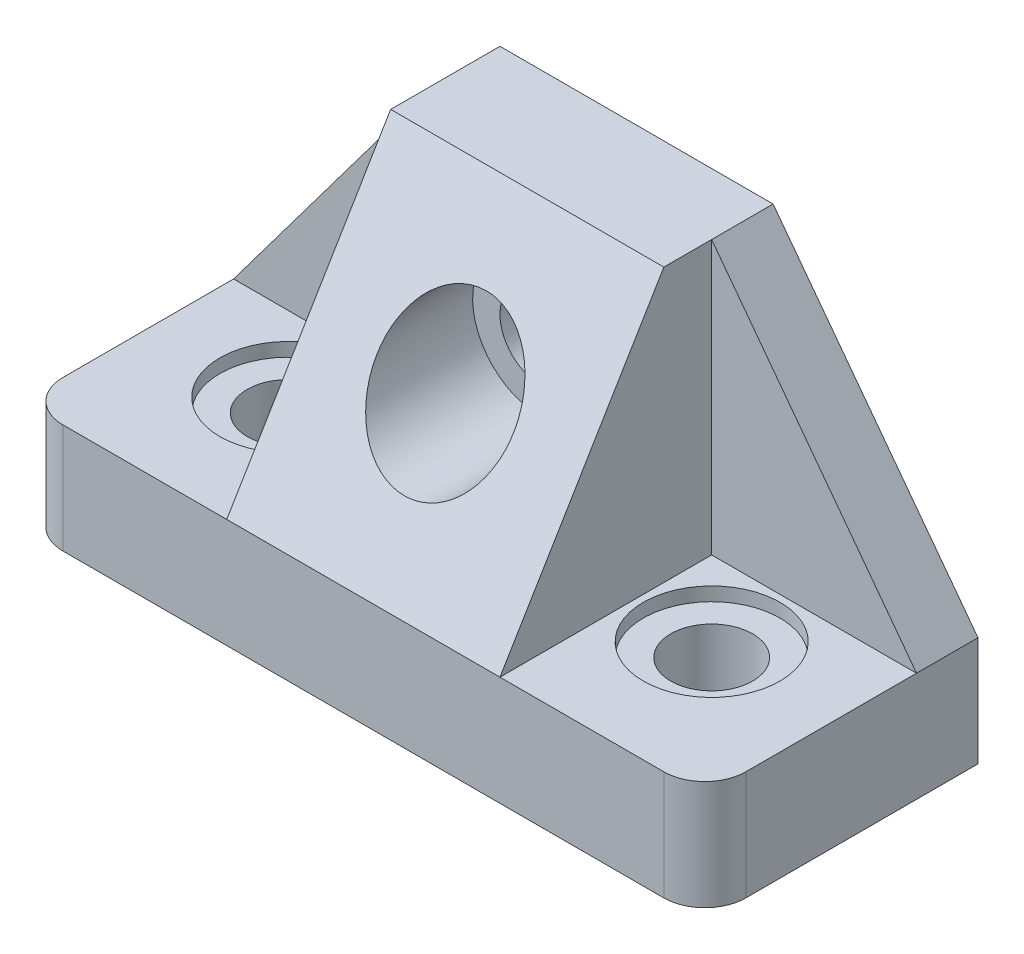
ISO-10303-21;
HEADER;
FILE_DESCRIPTION(('STEP AP214'),'2;1');
FILE_NAME('part.step','',(''),(''),'','','');
FILE_SCHEMA(('AUTOMOTIVE_DESIGN { 1 0 10303 214 1 1 1 1 }'));
ENDSEC;
DATA;
#1=APPLICATION_CONTEXT('core data for automotive mechanical design processes');
#2=APPLICATION_PROTOCOL_DEFINITION('international standard','automotive_design',2000,#1);
#3=PRODUCT_CONTEXT('',#1,'mechanical');
#4=PRODUCT('Part','Part','',(#3));
#5=PRODUCT_RELATED_PRODUCT_CATEGORY('part','',(#4));
#6=PRODUCT_DEFINITION_FORMATION('','',#4);
#7=PRODUCT_DEFINITION_CONTEXT('part definition',#1,'design');
#8=PRODUCT_DEFINITION('design','',#6,#7);
#9=PRODUCT_DEFINITION_SHAPE('','',#8);
#10=(LENGTH_UNIT() NAMED_UNIT(*) SI_UNIT(.MILLI.,.METRE.));
#11=(NAMED_UNIT(*) PLANE_ANGLE_UNIT() SI_UNIT($,.RADIAN.));
#12=(NAMED_UNIT(*) SI_UNIT($,.STERADIAN.) SOLID_ANGLE_UNIT());
#13=UNCERTAINTY_MEASURE_WITH_UNIT(LENGTH_MEASURE(1.E-05),#10,'distance_accuracy_value','');
#14=(GEOMETRIC_REPRESENTATION_CONTEXT(3) GLOBAL_UNCERTAINTY_ASSIGNED_CONTEXT((#13)) GLOBAL_UNIT_ASSIGNED_CONTEXT((#10,
#11,#12)) REPRESENTATION_CONTEXT('',''));
#15=CARTESIAN_POINT('',(0.,0.,0.));
#16=DIRECTION('',(0.,0.,1.));
#17=DIRECTION('',(1.,0.,0.));
#18=AXIS2_PLACEMENT_3D('',#15,#16,#17);
#19=CARTESIAN_POINT('',(22.,8.,7.));
#20=DIRECTION('',(0.,-1.,0.));
#21=DIRECTION('',(0.,0.,-1.));
#22=AXIS2_PLACEMENT_3D('',#19,#20,#21);
#23=CYLINDRICAL_SURFACE('',#22,3.);
#24=DIRECTION('',(0.,-1.,0.));
#25=VECTOR('',#24,1.);
#26=CARTESIAN_POINT('',(25.,8.,7.));
#27=LINE('',#26,#25);
#28=CARTESIAN_POINT('',(25.,8.,7.));
#29=VERTEX_POINT('',#28);
#30=CARTESIAN_POINT('',(25.,0.,7.));
#31=VERTEX_POINT('',#30);
#32=EDGE_CURVE('E195',#29,#31,#27,.T.);
#33=ORIENTED_EDGE('',*,*,#32,.F.);
#34=CARTESIAN_POINT('',(22.,8.,7.));
#35=DIRECTION('',(0.,1.,0.));
#36=DIRECTION('',(0.,0.,1.));
#37=AXIS2_PLACEMENT_3D('',#34,#35,#36);
#38=CIRCLE('',#37,3.);
#39=CARTESIAN_POINT('',(22.,8.,10.));
#40=VERTEX_POINT('',#39);
#41=EDGE_CURVE('E39',#40,#29,#38,.T.);
#42=ORIENTED_EDGE('',*,*,#41,.F.);
#43=DIRECTION('',(0.,-1.,0.));
#44=VECTOR('',#43,1.);
#45=CARTESIAN_POINT('',(22.,8.,10.));
#46=LINE('',#45,#44);
#47=CARTESIAN_POINT('',(22.,0.,10.));
#48=VERTEX_POINT('',#47);
#49=EDGE_CURVE('E198',#48,#40,#46,.F.);
#50=ORIENTED_EDGE('',*,*,#49,.F.);
#51=CARTESIAN_POINT('',(22.,0.,7.));
#52=DIRECTION('',(0.,1.,0.));
#53=DIRECTION('',(0.,0.,1.));
#54=AXIS2_PLACEMENT_3D('',#51,#52,#53);
#55=CIRCLE('',#54,3.);
#56=EDGE_CURVE('E11',#31,#48,#55,.F.);
#57=ORIENTED_EDGE('',*,*,#56,.F.);
#58=EDGE_LOOP('',(#33,#42,#50,#57));
#59=FACE_BOUND('',#58,.T.);
#60=ADVANCED_FACE('F32',(#59),#23,.T.);
#61=CARTESIAN_POINT('',(-22.,8.,7.));
#62=DIRECTION('',(0.,1.,0.));
#63=DIRECTION('',(0.,0.,1.));
#64=AXIS2_PLACEMENT_3D('',#61,#62,#63);
#65=CYLINDRICAL_SURFACE('',#64,3.);
#66=DIRECTION('',(0.,1.,0.));
#67=VECTOR('',#66,1.);
#68=CARTESIAN_POINT('',(-25.,8.,7.));
#69=LINE('',#68,#67);
#70=CARTESIAN_POINT('',(-25.,0.,7.));
#71=VERTEX_POINT('',#70);
#72=CARTESIAN_POINT('',(-25.,8.,7.));
#73=VERTEX_POINT('',#72);
#74=EDGE_CURVE('E184',#71,#73,#69,.T.);
#75=ORIENTED_EDGE('',*,*,#74,.F.);
#76=CARTESIAN_POINT('',(-22.,0.,7.));
#77=DIRECTION('',(0.,1.,0.));
#78=DIRECTION('',(0.,0.,1.));
#79=AXIS2_PLACEMENT_3D('',#76,#77,#78);
#80=CIRCLE('',#79,3.);
#81=CARTESIAN_POINT('',(-22.,0.,10.));
#82=VERTEX_POINT('',#81);
#83=EDGE_CURVE('E191',#82,#71,#80,.F.);
#84=ORIENTED_EDGE('',*,*,#83,.F.);
#85=DIRECTION('',(0.,1.,0.));
#86=VECTOR('',#85,1.);
#87=CARTESIAN_POINT('',(-22.,8.,10.));
#88=LINE('',#87,#86);
#89=CARTESIAN_POINT('',(-22.,8.,10.));
#90=VERTEX_POINT('',#89);
#91=EDGE_CURVE('E187',#90,#82,#88,.F.);
#92=ORIENTED_EDGE('',*,*,#91,.F.);
#93=CARTESIAN_POINT('',(-22.,8.,7.));
#94=DIRECTION('',(0.,1.,0.));
#95=DIRECTION('',(0.,0.,1.));
#96=AXIS2_PLACEMENT_3D('',#93,#94,#95);
#97=CIRCLE('',#96,3.);
#98=EDGE_CURVE('E193',#73,#90,#97,.T.);
#99=ORIENTED_EDGE('',*,*,#98,.F.);
#100=EDGE_LOOP('',(#75,#84,#92,#99));
#101=FACE_BOUND('',#100,.T.);
#102=ADVANCED_FACE('F333',(#101),#65,.T.);
#103=CARTESIAN_POINT('',(-25.,8.,-10.));
#104=DIRECTION('',(0.,0.,1.));
#105=DIRECTION('',(1.,0.,0.));
#106=AXIS2_PLACEMENT_3D('',#103,#104,#105);
#107=PLANE('',#106);
#108=CARTESIAN_POINT('',(0.,18.,-10.));
#109=DIRECTION('',(0.,0.,1.));
#110=DIRECTION('',(1.,0.,0.));
#111=AXIS2_PLACEMENT_3D('',#108,#109,#110);
#112=CIRCLE('',#111,3.);
#113=CARTESIAN_POINT('',(3.,18.,-10.));
#114=VERTEX_POINT('',#113);
#115=EDGE_CURVE('E309',#114,#114,#112,.T.);
#116=ORIENTED_EDGE('',*,*,#115,.T.);
#117=EDGE_LOOP('',(#116));
#118=FACE_BOUND('',#117,.T.);
#119=DIRECTION('',(0.,-1.,0.));
#120=VECTOR('',#119,1.);
#121=CARTESIAN_POINT('',(2.9,10.,-10.));
#122=LINE('',#121,#120);
#123=CARTESIAN_POINT('',(2.9,10.,-10.));
#124=VERTEX_POINT('',#123);
#125=CARTESIAN_POINT('',(2.9,0.,-10.));
#126=VERTEX_POINT('',#125);
#127=EDGE_CURVE('E158',#124,#126,#122,.T.);
#128=ORIENTED_EDGE('',*,*,#127,.F.);
#129=DIRECTION('',(-1.,0.,0.));
#130=VECTOR('',#129,1.);
#131=CARTESIAN_POINT('',(-2.9,10.,-10.));
#132=LINE('',#131,#130);
#133=CARTESIAN_POINT('',(-2.9,10.,-10.));
#134=VERTEX_POINT('',#133);
#135=EDGE_CURVE('E143',#124,#134,#132,.T.);
#136=ORIENTED_EDGE('',*,*,#135,.T.);
#137=DIRECTION('',(0.,-1.,0.));
#138=VECTOR('',#137,1.);
#139=CARTESIAN_POINT('',(-2.9,10.,-10.));
#140=LINE('',#139,#138);
#141=CARTESIAN_POINT('',(-2.9,0.,-10.));
#142=VERTEX_POINT('',#141);
#143=EDGE_CURVE('E168',#134,#142,#140,.T.);
#144=ORIENTED_EDGE('',*,*,#143,.T.);
#145=DIRECTION('',(-1.,0.,0.));
#146=VECTOR('',#145,1.);
#147=CARTESIAN_POINT('',(-25.,0.,-10.));
#148=LINE('',#147,#146);
#149=CARTESIAN_POINT('',(-25.,0.,-10.));
#150=VERTEX_POINT('',#149);
#151=EDGE_CURVE('E231',#142,#150,#148,.T.);
#152=ORIENTED_EDGE('',*,*,#151,.T.);
#153=DIRECTION('',(0.,-1.,0.));
#154=VECTOR('',#153,1.);
#155=CARTESIAN_POINT('',(-25.,8.,-10.));
#156=LINE('',#155,#154);
#157=CARTESIAN_POINT('',(-25.,8.,-10.));
#158=VERTEX_POINT('',#157);
#159=EDGE_CURVE('E228',#158,#150,#156,.T.);
#160=ORIENTED_EDGE('',*,*,#159,.F.);
#161=DIRECTION('',(-0.6,-0.8,0.));
#162=VECTOR('',#161,1.);
#163=CARTESIAN_POINT('',(-10.,28.,-10.));
#164=LINE('',#163,#162);
#165=CARTESIAN_POINT('',(-10.,28.,-10.));
#166=VERTEX_POINT('',#165);
#167=EDGE_CURVE('E298',#166,#158,#164,.T.);
#168=ORIENTED_EDGE('',*,*,#167,.F.);
#169=DIRECTION('',(-1.,0.,0.));
#170=VECTOR('',#169,1.);
#171=CARTESIAN_POINT('',(-10.,28.,-10.));
#172=LINE('',#171,#170);
#173=CARTESIAN_POINT('',(10.,28.,-10.));
#174=VERTEX_POINT('',#173);
#175=EDGE_CURVE('E269',#174,#166,#172,.T.);
#176=ORIENTED_EDGE('',*,*,#175,.F.);
#177=DIRECTION('',(0.6,-0.8,0.));
#178=VECTOR('',#177,1.);
#179=CARTESIAN_POINT('',(10.,28.,-10.));
#180=LINE('',#179,#178);
#181=CARTESIAN_POINT('',(25.,8.,-10.));
#182=VERTEX_POINT('',#181);
#183=EDGE_CURVE('E288',#174,#182,#180,.T.);
#184=ORIENTED_EDGE('',*,*,#183,.T.);
#185=DIRECTION('',(0.,-1.,0.));
#186=VECTOR('',#185,1.);
#187=CARTESIAN_POINT('',(25.,8.,-10.));
#188=LINE('',#187,#186);
#189=CARTESIAN_POINT('',(25.,0.,-10.));
#190=VERTEX_POINT('',#189);
#191=EDGE_CURVE('E188',#182,#190,#188,.T.);
#192=ORIENTED_EDGE('',*,*,#191,.T.);
#193=EDGE_CURVE('E167',#190,#126,#148,.T.);
#194=ORIENTED_EDGE('',*,*,#193,.T.);
#195=EDGE_LOOP('',(#128,#136,#144,#152,#160,#168,#176,#184,#192,#194));
#196=FACE_BOUND('',#195,.T.);
#197=ADVANCED_FACE('F164',(#118,#196),#107,.F.);
#198=CARTESIAN_POINT('',(0.,8.,0.));
#199=DIRECTION('',(0.,1.,0.));
#200=DIRECTION('',(0.,0.,1.));
#201=AXIS2_PLACEMENT_3D('',#198,#199,#200);
#202=PLANE('',#201);
#203=CARTESIAN_POINT('',(15.5,8.,0.));
#204=DIRECTION('',(0.,1.,0.));
#205=DIRECTION('',(0.,0.,1.));
#206=AXIS2_PLACEMENT_3D('',#203,#204,#205);
#207=CIRCLE('',#206,5.);
#208=CARTESIAN_POINT('',(15.5,8.,5.));
#209=VERTEX_POINT('',#208);
#210=EDGE_CURVE('E356',#209,#209,#207,.T.);
#211=ORIENTED_EDGE('',*,*,#210,.F.);
#212=EDGE_LOOP('',(#211));
#213=FACE_BOUND('',#212,.T.);
#214=DIRECTION('',(1.,0.,0.));
#215=VECTOR('',#214,1.);
#216=CARTESIAN_POINT('',(-25.,8.,10.));
#217=LINE('',#216,#215);
#218=CARTESIAN_POINT('',(10.,8.,10.));
#219=VERTEX_POINT('',#218);
#220=EDGE_CURVE('E207',#219,#40,#217,.T.);
#221=ORIENTED_EDGE('',*,*,#220,.T.);
#222=ORIENTED_EDGE('',*,*,#41,.T.);
#223=DIRECTION('',(0.,0.,-1.));
#224=VECTOR('',#223,1.);
#225=CARTESIAN_POINT('',(25.,8.,-10.));
#226=LINE('',#225,#224);
#227=CARTESIAN_POINT('',(25.,8.,-5.5));
#228=VERTEX_POINT('',#227);
#229=EDGE_CURVE('E204',#29,#228,#226,.T.);
#230=ORIENTED_EDGE('',*,*,#229,.T.);
#231=DIRECTION('',(-1.,0.,0.));
#232=VECTOR('',#231,1.);
#233=CARTESIAN_POINT('',(0.,8.,-5.5));
#234=LINE('',#233,#232);
#235=CARTESIAN_POINT('',(10.,8.,-5.5));
#236=VERTEX_POINT('',#235);
#237=EDGE_CURVE('E287',#228,#236,#234,.T.);
#238=ORIENTED_EDGE('',*,*,#237,.T.);
#239=DIRECTION('',(0.,0.,-1.));
#240=VECTOR('',#239,1.);
#241=CARTESIAN_POINT('',(10.,8.,-10.));
#242=LINE('',#241,#240);
#243=EDGE_CURVE('E245',#219,#236,#242,.T.);
#244=ORIENTED_EDGE('',*,*,#243,.F.);
#245=EDGE_LOOP('',(#221,#222,#230,#238,#244));
#246=FACE_BOUND('',#245,.T.);
#247=ADVANCED_FACE('F201',(#213,#246),#202,.T.);
#248=CARTESIAN_POINT('',(10.,28.,-10.));
#249=DIRECTION('',(-1.,0.,0.));
#250=DIRECTION('',(0.,0.,1.));
#251=AXIS2_PLACEMENT_3D('',#248,#249,#250);
#252=PLANE('',#251);
#253=DIRECTION('',(0.,-1.,0.));
#254=VECTOR('',#253,1.);
#255=CARTESIAN_POINT('',(10.,28.,-5.5));
#256=LINE('',#255,#254);
#257=CARTESIAN_POINT('',(10.,28.,-5.5));
#258=VERTEX_POINT('',#257);
#259=EDGE_CURVE('E284',#258,#236,#256,.T.);
#260=ORIENTED_EDGE('',*,*,#259,.F.);
#261=DIRECTION('',(0.,0.,-1.));
#262=VECTOR('',#261,1.);
#263=CARTESIAN_POINT('',(10.,28.,-10.));
#264=LINE('',#263,#262);
#265=CARTESIAN_POINT('',(10.,28.,-2.));
#266=VERTEX_POINT('',#265);
#267=EDGE_CURVE('E266',#266,#258,#264,.T.);
#268=ORIENTED_EDGE('',*,*,#267,.F.);
#269=DIRECTION('',(0.,-0.857492925712544,0.514495755427526));
#270=VECTOR('',#269,1.);
#271=CARTESIAN_POINT('',(10.,28.,-2.));
#272=LINE('',#271,#270);
#273=EDGE_CURVE('E257',#266,#219,#272,.T.);
#274=ORIENTED_EDGE('',*,*,#273,.T.);
#275=ORIENTED_EDGE('',*,*,#243,.T.);
#276=EDGE_LOOP('',(#260,#268,#274,#275));
#277=FACE_BOUND('',#276,.T.);
#278=ADVANCED_FACE('F283',(#277),#252,.F.);
#279=CARTESIAN_POINT('',(-15.5,8.,0.));
#280=DIRECTION('',(0.,1.,0.));
#281=DIRECTION('',(0.,0.,1.));
#282=AXIS2_PLACEMENT_3D('',#279,#280,#281);
#283=CIRCLE('',#282,5.);
#284=CARTESIAN_POINT('',(-15.5,8.,5.));
#285=VERTEX_POINT('',#284);
#286=EDGE_CURVE('E368',#285,#285,#283,.T.);
#287=ORIENTED_EDGE('',*,*,#286,.F.);
#288=EDGE_LOOP('',(#287));
#289=FACE_BOUND('',#288,.T.);
#290=DIRECTION('',(0.,0.,1.));
#291=VECTOR('',#290,1.);
#292=CARTESIAN_POINT('',(-25.,8.,-10.));
#293=LINE('',#292,#291);
#294=CARTESIAN_POINT('',(-25.,8.,-5.5));
#295=VERTEX_POINT('',#294);
#296=EDGE_CURVE('E213',#295,#73,#293,.T.);
#297=ORIENTED_EDGE('',*,*,#296,.T.);
#298=ORIENTED_EDGE('',*,*,#98,.T.);
#299=CARTESIAN_POINT('',(-10.,8.,10.));
#300=VERTEX_POINT('',#299);
#301=EDGE_CURVE('E226',#90,#300,#217,.T.);
#302=ORIENTED_EDGE('',*,*,#301,.T.);
#303=DIRECTION('',(0.,0.,1.));
#304=VECTOR('',#303,1.);
#305=CARTESIAN_POINT('',(-10.,8.,-10.));
#306=LINE('',#305,#304);
#307=CARTESIAN_POINT('',(-10.,8.,-5.5));
#308=VERTEX_POINT('',#307);
#309=EDGE_CURVE('E240',#308,#300,#306,.T.);
#310=ORIENTED_EDGE('',*,*,#309,.F.);
#311=DIRECTION('',(-1.,0.,0.));
#312=VECTOR('',#311,1.);
#313=CARTESIAN_POINT('',(0.,8.,-5.5));
#314=LINE('',#313,#312);
#315=EDGE_CURVE('E305',#308,#295,#314,.T.);
#316=ORIENTED_EDGE('',*,*,#315,.T.);
#317=EDGE_LOOP('',(#297,#298,#302,#310,#316));
#318=FACE_BOUND('',#317,.T.);
#319=ADVANCED_FACE('F379',(#289,#318),#202,.T.);
#320=CARTESIAN_POINT('',(-10.,28.,-10.));
#321=DIRECTION('',(1.,0.,0.));
#322=DIRECTION('',(0.,0.,-1.));
#323=AXIS2_PLACEMENT_3D('',#320,#321,#322);
#324=PLANE('',#323);
#325=DIRECTION('',(0.,1.,0.));
#326=VECTOR('',#325,1.);
#327=CARTESIAN_POINT('',(-10.,28.,-5.5));
#328=LINE('',#327,#326);
#329=CARTESIAN_POINT('',(-10.,28.,-5.5));
#330=VERTEX_POINT('',#329);
#331=EDGE_CURVE('E300',#308,#330,#328,.T.);
#332=ORIENTED_EDGE('',*,*,#331,.F.);
#333=ORIENTED_EDGE('',*,*,#309,.T.);
#334=DIRECTION('',(0.,-0.857492925712544,0.514495755427526));
#335=VECTOR('',#334,1.);
#336=CARTESIAN_POINT('',(-10.,28.,-2.));
#337=LINE('',#336,#335);
#338=CARTESIAN_POINT('',(-10.,28.,-2.));
#339=VERTEX_POINT('',#338);
#340=EDGE_CURVE('E262',#339,#300,#337,.T.);
#341=ORIENTED_EDGE('',*,*,#340,.F.);
#342=DIRECTION('',(0.,0.,1.));
#343=VECTOR('',#342,1.);
#344=CARTESIAN_POINT('',(-10.,28.,-10.));
#345=LINE('',#344,#343);
#346=EDGE_CURVE('E272',#330,#339,#345,.T.);
#347=ORIENTED_EDGE('',*,*,#346,.F.);
#348=EDGE_LOOP('',(#332,#333,#341,#347));
#349=FACE_BOUND('',#348,.T.);
#350=ADVANCED_FACE('F382',(#349),#324,.F.);
#351=CARTESIAN_POINT('',(0.,28.,-2.));
#352=DIRECTION('',(0.,0.514495755427526,0.857492925712544));
#353=DIRECTION('',(0.,-0.857492925712544,0.514495755427526));
#354=AXIS2_PLACEMENT_3D('',#351,#352,#353);
#355=PLANE('',#354);
#356=ORIENTED_EDGE('',*,*,#340,.T.);
#357=DIRECTION('',(1.,0.,0.));
#358=VECTOR('',#357,1.);
#359=CARTESIAN_POINT('',(0.,8.,10.));
#360=LINE('',#359,#358);
#361=EDGE_CURVE('E252',#300,#219,#360,.T.);
#362=ORIENTED_EDGE('',*,*,#361,.T.);
#363=ORIENTED_EDGE('',*,*,#273,.F.);
#364=DIRECTION('',(1.,0.,0.));
#365=VECTOR('',#364,1.);
#366=CARTESIAN_POINT('',(-10.,28.,-2.));
#367=LINE('',#366,#365);
#368=EDGE_CURVE('E232',#339,#266,#367,.T.);
#369=ORIENTED_EDGE('',*,*,#368,.F.);
#370=EDGE_LOOP('',(#356,#362,#363,#369));
#371=FACE_BOUND('',#370,.T.);
#372=CARTESIAN_POINT('',(0.,18.,4.));
#373=DIRECTION('',(0.,0.514495755427526,0.857492925712544));
#374=DIRECTION('',(0.,0.857492925712544,-0.514495755427526));
#375=AXIS2_PLACEMENT_3D('',#372,#373,#374);
#376=ELLIPSE('',#375,5.8309518948453,5.);
#377=CARTESIAN_POINT('',(0.,23.,1.));
#378=VERTEX_POINT('',#377);
#379=EDGE_CURVE('E246',#378,#378,#376,.F.);
#380=ORIENTED_EDGE('',*,*,#379,.T.);
#381=EDGE_LOOP('',(#380));
#382=FACE_BOUND('',#381,.T.);
#383=ADVANCED_FACE('F321',(#371,#382),#355,.T.);
#384=CARTESIAN_POINT('',(25.,8.,-10.));
#385=DIRECTION('',(-1.,0.,0.));
#386=DIRECTION('',(0.,0.,1.));
#387=AXIS2_PLACEMENT_3D('',#384,#385,#386);
#388=PLANE('',#387);
#389=ORIENTED_EDGE('',*,*,#229,.F.);
#390=ORIENTED_EDGE('',*,*,#32,.T.);
#391=DIRECTION('',(0.,0.,-1.));
#392=VECTOR('',#391,1.);
#393=CARTESIAN_POINT('',(25.,0.,-10.));
#394=LINE('',#393,#392);
#395=EDGE_CURVE('E229',#31,#190,#394,.T.);
#396=ORIENTED_EDGE('',*,*,#395,.T.);
#397=ORIENTED_EDGE('',*,*,#191,.F.);
#398=DIRECTION('',(0.,0.,-1.));
#399=VECTOR('',#398,1.);
#400=CARTESIAN_POINT('',(25.,8.,0.));
#401=LINE('',#400,#399);
#402=EDGE_CURVE('E212',#228,#182,#401,.T.);
#403=ORIENTED_EDGE('',*,*,#402,.F.);
#404=EDGE_LOOP('',(#389,#390,#396,#397,#403));
#405=FACE_BOUND('',#404,.T.);
#406=ADVANCED_FACE('F210',(#405),#388,.F.);
#407=CARTESIAN_POINT('',(-25.,8.,-10.));
#408=DIRECTION('',(1.,0.,0.));
#409=DIRECTION('',(0.,0.,-1.));
#410=AXIS2_PLACEMENT_3D('',#407,#408,#409);
#411=PLANE('',#410);
#412=DIRECTION('',(0.,0.,1.));
#413=VECTOR('',#412,1.);
#414=CARTESIAN_POINT('',(-25.,0.,-10.));
#415=LINE('',#414,#413);
#416=EDGE_CURVE('E220',#150,#71,#415,.T.);
#417=ORIENTED_EDGE('',*,*,#416,.T.);
#418=ORIENTED_EDGE('',*,*,#74,.T.);
#419=ORIENTED_EDGE('',*,*,#296,.F.);
#420=EDGE_CURVE('E217',#158,#295,#293,.T.);
#421=ORIENTED_EDGE('',*,*,#420,.F.);
#422=ORIENTED_EDGE('',*,*,#159,.T.);
#423=EDGE_LOOP('',(#417,#418,#419,#421,#422));
#424=FACE_BOUND('',#423,.T.);
#425=ADVANCED_FACE('F337',(#424),#411,.F.);
#426=CARTESIAN_POINT('',(-25.,8.,10.));
#427=DIRECTION('',(0.,0.,-1.));
#428=DIRECTION('',(-1.,0.,0.));
#429=AXIS2_PLACEMENT_3D('',#426,#427,#428);
#430=PLANE('',#429);
#431=DIRECTION('',(1.,0.,0.));
#432=VECTOR('',#431,1.);
#433=CARTESIAN_POINT('',(-25.,0.,10.));
#434=LINE('',#433,#432);
#435=EDGE_CURVE('E214',#82,#48,#434,.T.);
#436=ORIENTED_EDGE('',*,*,#435,.T.);
#437=ORIENTED_EDGE('',*,*,#49,.T.);
#438=ORIENTED_EDGE('',*,*,#220,.F.);
#439=ORIENTED_EDGE('',*,*,#361,.F.);
#440=ORIENTED_EDGE('',*,*,#301,.F.);
#441=ORIENTED_EDGE('',*,*,#91,.T.);
#442=EDGE_LOOP('',(#436,#437,#438,#439,#440,#441));
#443=FACE_BOUND('',#442,.T.);
#444=ADVANCED_FACE('F325',(#443),#430,.F.);
#445=CARTESIAN_POINT('',(0.,0.,0.));
#446=DIRECTION('',(0.,1.,0.));
#447=DIRECTION('',(0.,0.,1.));
#448=AXIS2_PLACEMENT_3D('',#445,#446,#447);
#449=PLANE('',#448);
#450=CARTESIAN_POINT('',(15.5,0.,0.));
#451=DIRECTION('',(0.,1.,0.));
#452=DIRECTION('',(0.,0.,1.));
#453=AXIS2_PLACEMENT_3D('',#450,#451,#452);
#454=CIRCLE('',#453,3.);
#455=CARTESIAN_POINT('',(15.5,0.,3.));
#456=VERTEX_POINT('',#455);
#457=EDGE_CURVE('E353',#456,#456,#454,.T.);
#458=ORIENTED_EDGE('',*,*,#457,.T.);
#459=EDGE_LOOP('',(#458));
#460=FACE_BOUND('',#459,.T.);
#461=CARTESIAN_POINT('',(-15.5,0.,0.));
#462=DIRECTION('',(0.,1.,0.));
#463=DIRECTION('',(0.,0.,1.));
#464=AXIS2_PLACEMENT_3D('',#461,#462,#463);
#465=CIRCLE('',#464,3.);
#466=CARTESIAN_POINT('',(-15.5,0.,3.));
#467=VERTEX_POINT('',#466);
#468=EDGE_CURVE('E365',#467,#467,#465,.T.);
#469=ORIENTED_EDGE('',*,*,#468,.T.);
#470=EDGE_LOOP('',(#469));
#471=FACE_BOUND('',#470,.T.);
#472=ORIENTED_EDGE('',*,*,#395,.F.);
#473=ORIENTED_EDGE('',*,*,#56,.T.);
#474=ORIENTED_EDGE('',*,*,#435,.F.);
#475=ORIENTED_EDGE('',*,*,#83,.T.);
#476=ORIENTED_EDGE('',*,*,#416,.F.);
#477=ORIENTED_EDGE('',*,*,#151,.F.);
#478=DIRECTION('',(0.,0.,-1.));
#479=VECTOR('',#478,1.);
#480=CARTESIAN_POINT('',(-2.9,0.,-10.));
#481=LINE('',#480,#479);
#482=CARTESIAN_POINT('',(-2.9,0.,-13.));
#483=VERTEX_POINT('',#482);
#484=EDGE_CURVE('E181',#142,#483,#481,.T.);
#485=ORIENTED_EDGE('',*,*,#484,.T.);
#486=DIRECTION('',(1.,0.,0.));
#487=VECTOR('',#486,1.);
#488=CARTESIAN_POINT('',(-2.9,0.,-13.));
#489=LINE('',#488,#487);
#490=CARTESIAN_POINT('',(2.9,0.,-13.));
#491=VERTEX_POINT('',#490);
#492=EDGE_CURVE('E161',#483,#491,#489,.T.);
#493=ORIENTED_EDGE('',*,*,#492,.T.);
#494=DIRECTION('',(0.,0.,1.));
#495=VECTOR('',#494,1.);
#496=CARTESIAN_POINT('',(2.9,0.,-10.));
#497=LINE('',#496,#495);
#498=EDGE_CURVE('E179',#491,#126,#497,.T.);
#499=ORIENTED_EDGE('',*,*,#498,.T.);
#500=ORIENTED_EDGE('',*,*,#193,.F.);
#501=EDGE_LOOP('',(#472,#473,#474,#475,#476,#477,#485,#493,#499,#500));
#502=FACE_BOUND('',#501,.T.);
#503=ADVANCED_FACE('F327',(#460,#471,#502),#449,.F.);
#504=CARTESIAN_POINT('',(0.,28.,0.));
#505=DIRECTION('',(0.,1.,0.));
#506=DIRECTION('',(0.,0.,1.));
#507=AXIS2_PLACEMENT_3D('',#504,#505,#506);
#508=PLANE('',#507);
#509=EDGE_CURVE('E273',#166,#330,#345,.T.);
#510=ORIENTED_EDGE('',*,*,#509,.T.);
#511=ORIENTED_EDGE('',*,*,#346,.T.);
#512=ORIENTED_EDGE('',*,*,#368,.T.);
#513=ORIENTED_EDGE('',*,*,#267,.T.);
#514=EDGE_CURVE('E244',#258,#174,#264,.T.);
#515=ORIENTED_EDGE('',*,*,#514,.T.);
#516=ORIENTED_EDGE('',*,*,#175,.T.);
#517=EDGE_LOOP('',(#510,#511,#512,#513,#515,#516));
#518=FACE_BOUND('',#517,.T.);
#519=ADVANCED_FACE('F279',(#518),#508,.T.);
#520=CARTESIAN_POINT('',(0.,18.,9.));
#521=DIRECTION('',(0.,0.,-1.));
#522=DIRECTION('',(-1.,0.,0.));
#523=AXIS2_PLACEMENT_3D('',#520,#521,#522);
#524=CYLINDRICAL_SURFACE('',#523,5.);
#525=ORIENTED_EDGE('',*,*,#379,.F.);
#526=EDGE_LOOP('',(#525));
#527=FACE_BOUND('',#526,.T.);
#528=CARTESIAN_POINT('',(0.,18.,-3.));
#529=DIRECTION('',(0.,0.,1.));
#530=DIRECTION('',(1.,0.,0.));
#531=AXIS2_PLACEMENT_3D('',#528,#529,#530);
#532=CIRCLE('',#531,5.);
#533=CARTESIAN_POINT('',(5.,18.,-3.));
#534=VERTEX_POINT('',#533);
#535=EDGE_CURVE('E312',#534,#534,#532,.T.);
#536=ORIENTED_EDGE('',*,*,#535,.F.);
#537=EDGE_LOOP('',(#536));
#538=FACE_BOUND('',#537,.T.);
#539=ADVANCED_FACE('F429',(#527,#538),#524,.F.);
#540=CARTESIAN_POINT('',(0.,18.,-3.));
#541=DIRECTION('',(0.,0.,1.));
#542=DIRECTION('',(1.,0.,0.));
#543=AXIS2_PLACEMENT_3D('',#540,#541,#542);
#544=PLANE('',#543);
#545=CARTESIAN_POINT('',(0.,18.,-3.));
#546=DIRECTION('',(0.,0.,1.));
#547=DIRECTION('',(1.,0.,0.));
#548=AXIS2_PLACEMENT_3D('',#545,#546,#547);
#549=CIRCLE('',#548,3.);
#550=CARTESIAN_POINT('',(3.,18.,-3.));
#551=VERTEX_POINT('',#550);
#552=EDGE_CURVE('E308',#551,#551,#549,.T.);
#553=ORIENTED_EDGE('',*,*,#552,.F.);
#554=EDGE_LOOP('',(#553));
#555=FACE_BOUND('',#554,.T.);
#556=ORIENTED_EDGE('',*,*,#535,.T.);
#557=EDGE_LOOP('',(#556));
#558=FACE_BOUND('',#557,.T.);
#559=ADVANCED_FACE('F399',(#555,#558),#544,.T.);
#560=CARTESIAN_POINT('',(0.,18.,-10.));
#561=DIRECTION('',(0.,0.,1.));
#562=DIRECTION('',(1.,0.,0.));
#563=AXIS2_PLACEMENT_3D('',#560,#561,#562);
#564=CYLINDRICAL_SURFACE('',#563,3.);
#565=ORIENTED_EDGE('',*,*,#115,.F.);
#566=EDGE_LOOP('',(#565));
#567=FACE_BOUND('',#566,.T.);
#568=ORIENTED_EDGE('',*,*,#552,.T.);
#569=EDGE_LOOP('',(#568));
#570=FACE_BOUND('',#569,.T.);
#571=ADVANCED_FACE('F391',(#567,#570),#564,.F.);
#572=CARTESIAN_POINT('',(-10.,28.,-10.));
#573=DIRECTION('',(0.8,-0.6,0.));
#574=DIRECTION('',(-0.6,-0.8,0.));
#575=AXIS2_PLACEMENT_3D('',#572,#573,#574);
#576=PLANE('',#575);
#577=ORIENTED_EDGE('',*,*,#167,.T.);
#578=ORIENTED_EDGE('',*,*,#420,.T.);
#579=DIRECTION('',(-0.6,-0.8,0.));
#580=VECTOR('',#579,1.);
#581=CARTESIAN_POINT('',(-10.,28.,-5.5));
#582=LINE('',#581,#580);
#583=EDGE_CURVE('E297',#330,#295,#582,.T.);
#584=ORIENTED_EDGE('',*,*,#583,.F.);
#585=ORIENTED_EDGE('',*,*,#509,.F.);
#586=EDGE_LOOP('',(#577,#578,#584,#585));
#587=FACE_BOUND('',#586,.T.);
#588=ADVANCED_FACE('F389',(#587),#576,.F.);
#589=CARTESIAN_POINT('',(0.,14.0000125,-5.5));
#590=DIRECTION('',(0.,0.,-1.));
#591=DIRECTION('',(-1.,0.,0.));
#592=AXIS2_PLACEMENT_3D('',#589,#590,#591);
#593=PLANE('',#592);
#594=ORIENTED_EDGE('',*,*,#315,.F.);
#595=ORIENTED_EDGE('',*,*,#331,.T.);
#596=ORIENTED_EDGE('',*,*,#583,.T.);
#597=EDGE_LOOP('',(#594,#595,#596));
#598=FACE_BOUND('',#597,.T.);
#599=ADVANCED_FACE('F387',(#598),#593,.F.);
#600=CARTESIAN_POINT('',(10.,28.,-10.));
#601=DIRECTION('',(0.8,0.6,0.));
#602=DIRECTION('',(0.6,-0.8,0.));
#603=AXIS2_PLACEMENT_3D('',#600,#601,#602);
#604=PLANE('',#603);
#605=DIRECTION('',(0.6,-0.8,0.));
#606=VECTOR('',#605,1.);
#607=CARTESIAN_POINT('',(10.,28.,-5.5));
#608=LINE('',#607,#606);
#609=EDGE_CURVE('E292',#258,#228,#608,.T.);
#610=ORIENTED_EDGE('',*,*,#609,.T.);
#611=ORIENTED_EDGE('',*,*,#402,.T.);
#612=ORIENTED_EDGE('',*,*,#183,.F.);
#613=ORIENTED_EDGE('',*,*,#514,.F.);
#614=EDGE_LOOP('',(#610,#611,#612,#613));
#615=FACE_BOUND('',#614,.T.);
#616=ADVANCED_FACE('F397',(#615),#604,.T.);
#617=CARTESIAN_POINT('',(1.24999999864817E-05,14.0000125,-5.5));
#618=DIRECTION('',(0.,0.,-1.));
#619=DIRECTION('',(-1.,0.,0.));
#620=AXIS2_PLACEMENT_3D('',#617,#618,#619);
#621=PLANE('',#620);
#622=ORIENTED_EDGE('',*,*,#237,.F.);
#623=ORIENTED_EDGE('',*,*,#609,.F.);
#624=ORIENTED_EDGE('',*,*,#259,.T.);
#625=EDGE_LOOP('',(#622,#623,#624));
#626=FACE_BOUND('',#625,.T.);
#627=ADVANCED_FACE('F462',(#626),#621,.F.);
#628=CARTESIAN_POINT('',(-15.5,7.,0.));
#629=DIRECTION('',(0.,1.,0.));
#630=DIRECTION('',(0.,0.,1.));
#631=AXIS2_PLACEMENT_3D('',#628,#629,#630);
#632=CYLINDRICAL_SURFACE('',#631,5.);
#633=CARTESIAN_POINT('',(-15.5,7.,0.));
#634=DIRECTION('',(0.,1.,0.));
#635=DIRECTION('',(0.,0.,1.));
#636=AXIS2_PLACEMENT_3D('',#633,#634,#635);
#637=CIRCLE('',#636,5.);
#638=CARTESIAN_POINT('',(-15.5,7.,5.));
#639=VERTEX_POINT('',#638);
#640=EDGE_CURVE('E371',#639,#639,#637,.T.);
#641=ORIENTED_EDGE('',*,*,#640,.F.);
#642=EDGE_LOOP('',(#641));
#643=FACE_BOUND('',#642,.T.);
#644=ORIENTED_EDGE('',*,*,#286,.T.);
#645=EDGE_LOOP('',(#644));
#646=FACE_BOUND('',#645,.T.);
#647=ADVANCED_FACE('F377',(#643,#646),#632,.F.);
#648=CARTESIAN_POINT('',(-15.5,7.,0.));
#649=DIRECTION('',(0.,1.,0.));
#650=DIRECTION('',(0.,0.,1.));
#651=AXIS2_PLACEMENT_3D('',#648,#649,#650);
#652=PLANE('',#651);
#653=CARTESIAN_POINT('',(-15.5,7.,0.));
#654=DIRECTION('',(0.,1.,0.));
#655=DIRECTION('',(0.,0.,1.));
#656=AXIS2_PLACEMENT_3D('',#653,#654,#655);
#657=CIRCLE('',#656,3.);
#658=CARTESIAN_POINT('',(-15.5,7.,3.));
#659=VERTEX_POINT('',#658);
#660=EDGE_CURVE('E362',#659,#659,#657,.T.);
#661=ORIENTED_EDGE('',*,*,#660,.F.);
#662=EDGE_LOOP('',(#661));
#663=FACE_BOUND('',#662,.T.);
#664=ORIENTED_EDGE('',*,*,#640,.T.);
#665=EDGE_LOOP('',(#664));
#666=FACE_BOUND('',#665,.T.);
#667=ADVANCED_FACE('F481',(#663,#666),#652,.T.);
#668=CARTESIAN_POINT('',(-15.5,0.,0.));
#669=DIRECTION('',(0.,1.,0.));
#670=DIRECTION('',(0.,0.,1.));
#671=AXIS2_PLACEMENT_3D('',#668,#669,#670);
#672=CYLINDRICAL_SURFACE('',#671,3.);
#673=ORIENTED_EDGE('',*,*,#468,.F.);
#674=EDGE_LOOP('',(#673));
#675=FACE_BOUND('',#674,.T.);
#676=ORIENTED_EDGE('',*,*,#660,.T.);
#677=EDGE_LOOP('',(#676));
#678=FACE_BOUND('',#677,.T.);
#679=ADVANCED_FACE('F491',(#675,#678),#672,.F.);
#680=CARTESIAN_POINT('',(15.5,7.,0.));
#681=DIRECTION('',(0.,1.,0.));
#682=DIRECTION('',(0.,0.,1.));
#683=AXIS2_PLACEMENT_3D('',#680,#681,#682);
#684=CYLINDRICAL_SURFACE('',#683,5.);
#685=CARTESIAN_POINT('',(15.5,7.,0.));
#686=DIRECTION('',(0.,1.,0.));
#687=DIRECTION('',(0.,0.,1.));
#688=AXIS2_PLACEMENT_3D('',#685,#686,#687);
#689=CIRCLE('',#688,5.);
#690=CARTESIAN_POINT('',(15.5,7.,5.));
#691=VERTEX_POINT('',#690);
#692=EDGE_CURVE('E359',#691,#691,#689,.T.);
#693=ORIENTED_EDGE('',*,*,#692,.F.);
#694=EDGE_LOOP('',(#693));
#695=FACE_BOUND('',#694,.T.);
#696=ORIENTED_EDGE('',*,*,#210,.T.);
#697=EDGE_LOOP('',(#696));
#698=FACE_BOUND('',#697,.T.);
#699=ADVANCED_FACE('F501',(#695,#698),#684,.F.);
#700=CARTESIAN_POINT('',(15.5,7.,0.));
#701=DIRECTION('',(0.,1.,0.));
#702=DIRECTION('',(0.,0.,1.));
#703=AXIS2_PLACEMENT_3D('',#700,#701,#702);
#704=PLANE('',#703);
#705=CARTESIAN_POINT('',(15.5,7.,0.));
#706=DIRECTION('',(0.,1.,0.));
#707=DIRECTION('',(0.,0.,1.));
#708=AXIS2_PLACEMENT_3D('',#705,#706,#707);
#709=CIRCLE('',#708,3.);
#710=CARTESIAN_POINT('',(15.5,7.,3.));
#711=VERTEX_POINT('',#710);
#712=EDGE_CURVE('E350',#711,#711,#709,.T.);
#713=ORIENTED_EDGE('',*,*,#712,.F.);
#714=EDGE_LOOP('',(#713));
#715=FACE_BOUND('',#714,.T.);
#716=ORIENTED_EDGE('',*,*,#692,.T.);
#717=EDGE_LOOP('',(#716));
#718=FACE_BOUND('',#717,.T.);
#719=ADVANCED_FACE('F511',(#715,#718),#704,.T.);
#720=CARTESIAN_POINT('',(15.5,0.,0.));
#721=DIRECTION('',(0.,1.,0.));
#722=DIRECTION('',(0.,0.,1.));
#723=AXIS2_PLACEMENT_3D('',#720,#721,#722);
#724=CYLINDRICAL_SURFACE('',#723,3.);
#725=ORIENTED_EDGE('',*,*,#457,.F.);
#726=EDGE_LOOP('',(#725));
#727=FACE_BOUND('',#726,.T.);
#728=ORIENTED_EDGE('',*,*,#712,.T.);
#729=EDGE_LOOP('',(#728));
#730=FACE_BOUND('',#729,.T.);
#731=ADVANCED_FACE('F521',(#727,#730),#724,.F.);
#732=CARTESIAN_POINT('',(2.9,10.,-10.));
#733=DIRECTION('',(1.,0.,0.));
#734=DIRECTION('',(0.,0.,-1.));
#735=AXIS2_PLACEMENT_3D('',#732,#733,#734);
#736=PLANE('',#735);
#737=ORIENTED_EDGE('',*,*,#498,.F.);
#738=DIRECTION('',(0.,-1.,0.));
#739=VECTOR('',#738,1.);
#740=CARTESIAN_POINT('',(2.9,10.,-13.));
#741=LINE('',#740,#739);
#742=CARTESIAN_POINT('',(2.9,10.,-13.));
#743=VERTEX_POINT('',#742);
#744=EDGE_CURVE('E160',#743,#491,#741,.T.);
#745=ORIENTED_EDGE('',*,*,#744,.F.);
#746=DIRECTION('',(0.,0.,1.));
#747=VECTOR('',#746,1.);
#748=CARTESIAN_POINT('',(2.9,10.,-10.));
#749=LINE('',#748,#747);
#750=EDGE_CURVE('E147',#743,#124,#749,.T.);
#751=ORIENTED_EDGE('',*,*,#750,.T.);
#752=ORIENTED_EDGE('',*,*,#127,.T.);
#753=EDGE_LOOP('',(#737,#745,#751,#752));
#754=FACE_BOUND('',#753,.T.);
#755=ADVANCED_FACE('F157',(#754),#736,.T.);
#756=CARTESIAN_POINT('',(-2.9,10.,-13.));
#757=DIRECTION('',(0.,0.,-1.));
#758=DIRECTION('',(-1.,0.,0.));
#759=AXIS2_PLACEMENT_3D('',#756,#757,#758);
#760=PLANE('',#759);
#761=ORIENTED_EDGE('',*,*,#492,.F.);
#762=DIRECTION('',(0.,-1.,0.));
#763=VECTOR('',#762,1.);
#764=CARTESIAN_POINT('',(-2.9,10.,-13.));
#765=LINE('',#764,#763);
#766=CARTESIAN_POINT('',(-2.9,10.,-13.));
#767=VERTEX_POINT('',#766);
#768=EDGE_CURVE('E171',#767,#483,#765,.T.);
#769=ORIENTED_EDGE('',*,*,#768,.F.);
#770=DIRECTION('',(1.,0.,0.));
#771=VECTOR('',#770,1.);
#772=CARTESIAN_POINT('',(-2.9,10.,-13.));
#773=LINE('',#772,#771);
#774=EDGE_CURVE('E169',#767,#743,#773,.T.);
#775=ORIENTED_EDGE('',*,*,#774,.T.);
#776=ORIENTED_EDGE('',*,*,#744,.T.);
#777=EDGE_LOOP('',(#761,#769,#775,#776));
#778=FACE_BOUND('',#777,.T.);
#779=ADVANCED_FACE('F549',(#778),#760,.T.);
#780=CARTESIAN_POINT('',(-2.9,10.,-10.));
#781=DIRECTION('',(-1.,0.,0.));
#782=DIRECTION('',(0.,0.,1.));
#783=AXIS2_PLACEMENT_3D('',#780,#781,#782);
#784=PLANE('',#783);
#785=ORIENTED_EDGE('',*,*,#484,.F.);
#786=ORIENTED_EDGE('',*,*,#143,.F.);
#787=DIRECTION('',(0.,0.,-1.));
#788=VECTOR('',#787,1.);
#789=CARTESIAN_POINT('',(-2.9,10.,-10.));
#790=LINE('',#789,#788);
#791=EDGE_CURVE('E150',#134,#767,#790,.T.);
#792=ORIENTED_EDGE('',*,*,#791,.T.);
#793=ORIENTED_EDGE('',*,*,#768,.T.);
#794=EDGE_LOOP('',(#785,#786,#792,#793));
#795=FACE_BOUND('',#794,.T.);
#796=ADVANCED_FACE('F558',(#795),#784,.T.);
#797=CARTESIAN_POINT('',(0.,10.,0.));
#798=DIRECTION('',(0.,-1.,0.));
#799=DIRECTION('',(0.,0.,-1.));
#800=AXIS2_PLACEMENT_3D('',#797,#798,#799);
#801=PLANE('',#800);
#802=ORIENTED_EDGE('',*,*,#750,.F.);
#803=ORIENTED_EDGE('',*,*,#774,.F.);
#804=ORIENTED_EDGE('',*,*,#791,.F.);
#805=ORIENTED_EDGE('',*,*,#135,.F.);
#806=EDGE_LOOP('',(#802,#803,#804,#805));
#807=FACE_BOUND('',#806,.T.);
#808=ADVANCED_FACE('F145',(#807),#801,.F.);
#809=CLOSED_SHELL('',(#60,#102,#197,#247,#278,#319,#350,#383,#406,#425,#444,#503,#519,#539,#559,
#571,#588,#599,#616,#627,#647,#667,#679,#699,#719,#731,#755,#779,#796,#808));
#810=MANIFOLD_SOLID_BREP('B2',#809);
#811=ADVANCED_BREP_SHAPE_REPRESENTATION('',(#18,#810),#14);
#812=SHAPE_DEFINITION_REPRESENTATION(#9,#811);
ENDSEC;
END-ISO-10303-21;
